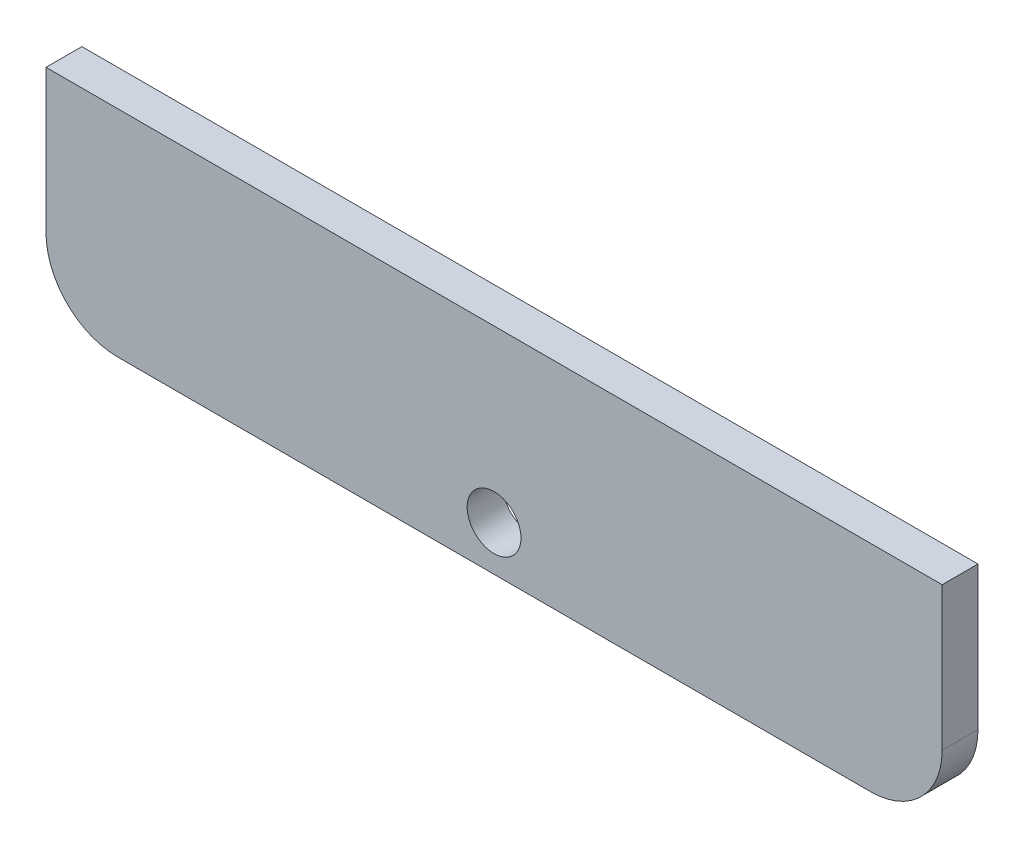
ISO-10303-21;
HEADER;
FILE_DESCRIPTION(('STEP AP214'),'2;1');
FILE_NAME('part.step','',(''),(''),'','','');
FILE_SCHEMA(('AUTOMOTIVE_DESIGN { 1 0 10303 214 1 1 1 1 }'));
ENDSEC;
DATA;
#1=APPLICATION_CONTEXT('core data for automotive mechanical design processes');
#2=APPLICATION_PROTOCOL_DEFINITION('international standard','automotive_design',2000,#1);
#3=PRODUCT_CONTEXT('',#1,'mechanical');
#4=PRODUCT('Part','Part','',(#3));
#5=PRODUCT_RELATED_PRODUCT_CATEGORY('part','',(#4));
#6=PRODUCT_DEFINITION_FORMATION('','',#4);
#7=PRODUCT_DEFINITION_CONTEXT('part definition',#1,'design');
#8=PRODUCT_DEFINITION('design','',#6,#7);
#9=PRODUCT_DEFINITION_SHAPE('','',#8);
#10=(LENGTH_UNIT() NAMED_UNIT(*) SI_UNIT(.MILLI.,.METRE.));
#11=(NAMED_UNIT(*) PLANE_ANGLE_UNIT() SI_UNIT($,.RADIAN.));
#12=(NAMED_UNIT(*) SI_UNIT($,.STERADIAN.) SOLID_ANGLE_UNIT());
#13=UNCERTAINTY_MEASURE_WITH_UNIT(LENGTH_MEASURE(1.E-05),#10,'distance_accuracy_value','');
#14=(GEOMETRIC_REPRESENTATION_CONTEXT(3) GLOBAL_UNCERTAINTY_ASSIGNED_CONTEXT((#13)) GLOBAL_UNIT_ASSIGNED_CONTEXT((#10,
#11,#12)) REPRESENTATION_CONTEXT('',''));
#15=CARTESIAN_POINT('',(0.,0.,0.));
#16=DIRECTION('',(0.,0.,1.));
#17=DIRECTION('',(1.,0.,0.));
#18=AXIS2_PLACEMENT_3D('',#15,#16,#17);
#19=CARTESIAN_POINT('',(21.,1.5,1.));
#20=DIRECTION('',(0.,0.,-1.));
#21=DIRECTION('',(-1.,0.,0.));
#22=AXIS2_PLACEMENT_3D('',#19,#20,#21);
#23=PLANE('',#22);
#24=CARTESIAN_POINT('',(21.,1.5,1.));
#25=DIRECTION('',(0.,0.,1.));
#26=DIRECTION('',(-1.,0.,0.));
#27=AXIS2_PLACEMENT_3D('',#24,#25,#26);
#28=CIRCLE('',#27,4.);
#29=CARTESIAN_POINT('',(21.,-2.5,1.));
#30=VERTEX_POINT('',#29);
#31=CARTESIAN_POINT('',(25.,1.5,1.));
#32=VERTEX_POINT('',#31);
#33=EDGE_CURVE('E129',#30,#32,#28,.T.);
#34=ORIENTED_EDGE('',*,*,#33,.T.);
#35=DIRECTION('',(0.,1.,0.));
#36=VECTOR('',#35,1.);
#37=CARTESIAN_POINT('',(25.,1.5,1.));
#38=LINE('',#37,#36);
#39=CARTESIAN_POINT('',(25.,9.5,1.));
#40=VERTEX_POINT('',#39);
#41=EDGE_CURVE('E87',#32,#40,#38,.T.);
#42=ORIENTED_EDGE('',*,*,#41,.T.);
#43=DIRECTION('',(-1.,0.,0.));
#44=VECTOR('',#43,1.);
#45=CARTESIAN_POINT('',(-25.,9.5,1.));
#46=LINE('',#45,#44);
#47=CARTESIAN_POINT('',(-25.,9.5,1.));
#48=VERTEX_POINT('',#47);
#49=EDGE_CURVE('E100',#40,#48,#46,.T.);
#50=ORIENTED_EDGE('',*,*,#49,.T.);
#51=DIRECTION('',(0.,-1.,0.));
#52=VECTOR('',#51,1.);
#53=CARTESIAN_POINT('',(-25.,1.5,1.));
#54=LINE('',#53,#52);
#55=CARTESIAN_POINT('',(-25.,1.5,1.));
#56=VERTEX_POINT('',#55);
#57=EDGE_CURVE('E94',#48,#56,#54,.T.);
#58=ORIENTED_EDGE('',*,*,#57,.T.);
#59=CARTESIAN_POINT('',(-21.,1.5,1.));
#60=DIRECTION('',(0.,0.,1.));
#61=DIRECTION('',(-1.,0.,0.));
#62=AXIS2_PLACEMENT_3D('',#59,#60,#61);
#63=CIRCLE('',#62,4.);
#64=CARTESIAN_POINT('',(-21.,-2.5,1.));
#65=VERTEX_POINT('',#64);
#66=EDGE_CURVE('E98',#56,#65,#63,.T.);
#67=ORIENTED_EDGE('',*,*,#66,.T.);
#68=DIRECTION('',(1.,0.,0.));
#69=VECTOR('',#68,1.);
#70=CARTESIAN_POINT('',(-21.,-2.5,1.));
#71=LINE('',#70,#69);
#72=EDGE_CURVE('E50',#65,#30,#71,.T.);
#73=ORIENTED_EDGE('',*,*,#72,.T.);
#74=EDGE_LOOP('',(#34,#42,#50,#58,#67,#73));
#75=FACE_BOUND('',#74,.T.);
#76=CARTESIAN_POINT('',(0.,0.,1.));
#77=DIRECTION('',(0.,0.,1.));
#78=DIRECTION('',(1.,0.,0.));
#79=AXIS2_PLACEMENT_3D('',#76,#77,#78);
#80=CIRCLE('',#79,1.5);
#81=CARTESIAN_POINT('',(1.5,0.,1.));
#82=VERTEX_POINT('',#81);
#83=EDGE_CURVE('E122',#82,#82,#80,.T.);
#84=ORIENTED_EDGE('',*,*,#83,.F.);
#85=EDGE_LOOP('',(#84));
#86=FACE_BOUND('',#85,.T.);
#87=ADVANCED_FACE('F33',(#75,#86),#23,.F.);
#88=CARTESIAN_POINT('',(21.,1.5,-1.));
#89=DIRECTION('',(0.,0.,-1.));
#90=DIRECTION('',(-1.,0.,0.));
#91=AXIS2_PLACEMENT_3D('',#88,#89,#90);
#92=PLANE('',#91);
#93=CARTESIAN_POINT('',(21.,1.5,-1.));
#94=DIRECTION('',(0.,0.,1.));
#95=DIRECTION('',(-1.,0.,0.));
#96=AXIS2_PLACEMENT_3D('',#93,#94,#95);
#97=CIRCLE('',#96,4.);
#98=CARTESIAN_POINT('',(21.,-2.5,-1.));
#99=VERTEX_POINT('',#98);
#100=CARTESIAN_POINT('',(25.,1.5,-1.));
#101=VERTEX_POINT('',#100);
#102=EDGE_CURVE('E118',#99,#101,#97,.T.);
#103=ORIENTED_EDGE('',*,*,#102,.F.);
#104=DIRECTION('',(1.,0.,0.));
#105=VECTOR('',#104,1.);
#106=CARTESIAN_POINT('',(-21.,-2.5,-1.));
#107=LINE('',#106,#105);
#108=CARTESIAN_POINT('',(-21.,-2.5,-1.));
#109=VERTEX_POINT('',#108);
#110=EDGE_CURVE('E79',#109,#99,#107,.T.);
#111=ORIENTED_EDGE('',*,*,#110,.F.);
#112=CARTESIAN_POINT('',(-21.,1.5,-1.));
#113=DIRECTION('',(0.,0.,1.));
#114=DIRECTION('',(-1.,0.,0.));
#115=AXIS2_PLACEMENT_3D('',#112,#113,#114);
#116=CIRCLE('',#115,4.);
#117=CARTESIAN_POINT('',(-25.,1.5,-1.));
#118=VERTEX_POINT('',#117);
#119=EDGE_CURVE('E73',#118,#109,#116,.T.);
#120=ORIENTED_EDGE('',*,*,#119,.F.);
#121=DIRECTION('',(0.,-1.,0.));
#122=VECTOR('',#121,1.);
#123=CARTESIAN_POINT('',(-25.,1.5,-1.));
#124=LINE('',#123,#122);
#125=CARTESIAN_POINT('',(-25.,9.5,-1.));
#126=VERTEX_POINT('',#125);
#127=EDGE_CURVE('E108',#126,#118,#124,.T.);
#128=ORIENTED_EDGE('',*,*,#127,.F.);
#129=DIRECTION('',(-1.,0.,0.));
#130=VECTOR('',#129,1.);
#131=CARTESIAN_POINT('',(-25.,9.5,-1.));
#132=LINE('',#131,#130);
#133=CARTESIAN_POINT('',(25.,9.5,-1.));
#134=VERTEX_POINT('',#133);
#135=EDGE_CURVE('E124',#134,#126,#132,.T.);
#136=ORIENTED_EDGE('',*,*,#135,.F.);
#137=DIRECTION('',(0.,1.,0.));
#138=VECTOR('',#137,1.);
#139=CARTESIAN_POINT('',(25.,1.5,-1.));
#140=LINE('',#139,#138);
#141=EDGE_CURVE('E121',#101,#134,#140,.T.);
#142=ORIENTED_EDGE('',*,*,#141,.F.);
#143=EDGE_LOOP('',(#103,#111,#120,#128,#136,#142));
#144=FACE_BOUND('',#143,.T.);
#145=CARTESIAN_POINT('',(0.,0.,-1.));
#146=DIRECTION('',(0.,0.,1.));
#147=DIRECTION('',(1.,0.,0.));
#148=AXIS2_PLACEMENT_3D('',#145,#146,#147);
#149=CIRCLE('',#148,1.5);
#150=CARTESIAN_POINT('',(1.5,0.,-1.));
#151=VERTEX_POINT('',#150);
#152=EDGE_CURVE('E222',#151,#151,#149,.T.);
#153=ORIENTED_EDGE('',*,*,#152,.T.);
#154=EDGE_LOOP('',(#153));
#155=FACE_BOUND('',#154,.T.);
#156=ADVANCED_FACE('F138',(#144,#155),#92,.T.);
#157=CARTESIAN_POINT('',(21.,1.5,1.));
#158=DIRECTION('',(0.,0.,-1.));
#159=DIRECTION('',(-1.,0.,0.));
#160=AXIS2_PLACEMENT_3D('',#157,#158,#159);
#161=CYLINDRICAL_SURFACE('',#160,4.);
#162=ORIENTED_EDGE('',*,*,#102,.T.);
#163=DIRECTION('',(0.,0.,-1.));
#164=VECTOR('',#163,1.);
#165=CARTESIAN_POINT('',(25.,1.5,1.));
#166=LINE('',#165,#164);
#167=EDGE_CURVE('E11',#32,#101,#166,.T.);
#168=ORIENTED_EDGE('',*,*,#167,.F.);
#169=ORIENTED_EDGE('',*,*,#33,.F.);
#170=DIRECTION('',(0.,0.,-1.));
#171=VECTOR('',#170,1.);
#172=CARTESIAN_POINT('',(21.,-2.5,1.));
#173=LINE('',#172,#171);
#174=EDGE_CURVE('E114',#30,#99,#173,.T.);
#175=ORIENTED_EDGE('',*,*,#174,.T.);
#176=EDGE_LOOP('',(#162,#168,#169,#175));
#177=FACE_BOUND('',#176,.T.);
#178=ADVANCED_FACE('F35',(#177),#161,.T.);
#179=CARTESIAN_POINT('',(25.,1.5,1.));
#180=DIRECTION('',(-1.,0.,0.));
#181=DIRECTION('',(0.,-1.,0.));
#182=AXIS2_PLACEMENT_3D('',#179,#180,#181);
#183=PLANE('',#182);
#184=ORIENTED_EDGE('',*,*,#141,.T.);
#185=DIRECTION('',(0.,0.,-1.));
#186=VECTOR('',#185,1.);
#187=CARTESIAN_POINT('',(25.,9.5,1.));
#188=LINE('',#187,#186);
#189=EDGE_CURVE('E42',#40,#134,#188,.T.);
#190=ORIENTED_EDGE('',*,*,#189,.F.);
#191=ORIENTED_EDGE('',*,*,#41,.F.);
#192=ORIENTED_EDGE('',*,*,#167,.T.);
#193=EDGE_LOOP('',(#184,#190,#191,#192));
#194=FACE_BOUND('',#193,.T.);
#195=ADVANCED_FACE('F163',(#194),#183,.F.);
#196=CARTESIAN_POINT('',(-25.,9.5,1.));
#197=DIRECTION('',(0.,-1.,0.));
#198=DIRECTION('',(0.,0.,-1.));
#199=AXIS2_PLACEMENT_3D('',#196,#197,#198);
#200=PLANE('',#199);
#201=ORIENTED_EDGE('',*,*,#135,.T.);
#202=DIRECTION('',(0.,0.,-1.));
#203=VECTOR('',#202,1.);
#204=CARTESIAN_POINT('',(-25.,9.5,1.));
#205=LINE('',#204,#203);
#206=EDGE_CURVE('E109',#48,#126,#205,.T.);
#207=ORIENTED_EDGE('',*,*,#206,.F.);
#208=ORIENTED_EDGE('',*,*,#49,.F.);
#209=ORIENTED_EDGE('',*,*,#189,.T.);
#210=EDGE_LOOP('',(#201,#207,#208,#209));
#211=FACE_BOUND('',#210,.T.);
#212=ADVANCED_FACE('F135',(#211),#200,.F.);
#213=CARTESIAN_POINT('',(-25.,1.5,1.));
#214=DIRECTION('',(1.,0.,0.));
#215=DIRECTION('',(0.,1.,0.));
#216=AXIS2_PLACEMENT_3D('',#213,#214,#215);
#217=PLANE('',#216);
#218=ORIENTED_EDGE('',*,*,#127,.T.);
#219=DIRECTION('',(0.,0.,-1.));
#220=VECTOR('',#219,1.);
#221=CARTESIAN_POINT('',(-25.,1.5,1.));
#222=LINE('',#221,#220);
#223=EDGE_CURVE('E105',#56,#118,#222,.T.);
#224=ORIENTED_EDGE('',*,*,#223,.F.);
#225=ORIENTED_EDGE('',*,*,#57,.F.);
#226=ORIENTED_EDGE('',*,*,#206,.T.);
#227=EDGE_LOOP('',(#218,#224,#225,#226));
#228=FACE_BOUND('',#227,.T.);
#229=ADVANCED_FACE('F106',(#228),#217,.F.);
#230=CARTESIAN_POINT('',(-21.,1.5,1.));
#231=DIRECTION('',(0.,0.,-1.));
#232=DIRECTION('',(-1.,0.,0.));
#233=AXIS2_PLACEMENT_3D('',#230,#231,#232);
#234=CYLINDRICAL_SURFACE('',#233,4.);
#235=ORIENTED_EDGE('',*,*,#119,.T.);
#236=DIRECTION('',(0.,0.,-1.));
#237=VECTOR('',#236,1.);
#238=CARTESIAN_POINT('',(-21.,-2.5,1.));
#239=LINE('',#238,#237);
#240=EDGE_CURVE('E110',#65,#109,#239,.T.);
#241=ORIENTED_EDGE('',*,*,#240,.F.);
#242=ORIENTED_EDGE('',*,*,#66,.F.);
#243=ORIENTED_EDGE('',*,*,#223,.T.);
#244=EDGE_LOOP('',(#235,#241,#242,#243));
#245=FACE_BOUND('',#244,.T.);
#246=ADVANCED_FACE('F112',(#245),#234,.T.);
#247=CARTESIAN_POINT('',(-21.,-2.5,1.));
#248=DIRECTION('',(0.,1.,0.));
#249=DIRECTION('',(0.,0.,1.));
#250=AXIS2_PLACEMENT_3D('',#247,#248,#249);
#251=PLANE('',#250);
#252=ORIENTED_EDGE('',*,*,#110,.T.);
#253=ORIENTED_EDGE('',*,*,#174,.F.);
#254=ORIENTED_EDGE('',*,*,#72,.F.);
#255=ORIENTED_EDGE('',*,*,#240,.T.);
#256=EDGE_LOOP('',(#252,#253,#254,#255));
#257=FACE_BOUND('',#256,.T.);
#258=ADVANCED_FACE('F143',(#257),#251,.F.);
#259=CARTESIAN_POINT('',(0.,0.,1.));
#260=DIRECTION('',(0.,0.,-1.));
#261=DIRECTION('',(-1.,0.,0.));
#262=AXIS2_PLACEMENT_3D('',#259,#260,#261);
#263=CYLINDRICAL_SURFACE('',#262,1.5);
#264=ORIENTED_EDGE('',*,*,#83,.T.);
#265=EDGE_LOOP('',(#264));
#266=FACE_BOUND('',#265,.T.);
#267=ORIENTED_EDGE('',*,*,#152,.F.);
#268=EDGE_LOOP('',(#267));
#269=FACE_BOUND('',#268,.T.);
#270=ADVANCED_FACE('F145',(#266,#269),#263,.F.);
#271=CLOSED_SHELL('',(#87,#156,#178,#195,#212,#229,#246,#258,#270));
#272=MANIFOLD_SOLID_BREP('B2',#271);
#273=ADVANCED_BREP_SHAPE_REPRESENTATION('',(#18,#272),#14);
#274=SHAPE_DEFINITION_REPRESENTATION(#9,#273);
ENDSEC;
END-ISO-10303-21;
